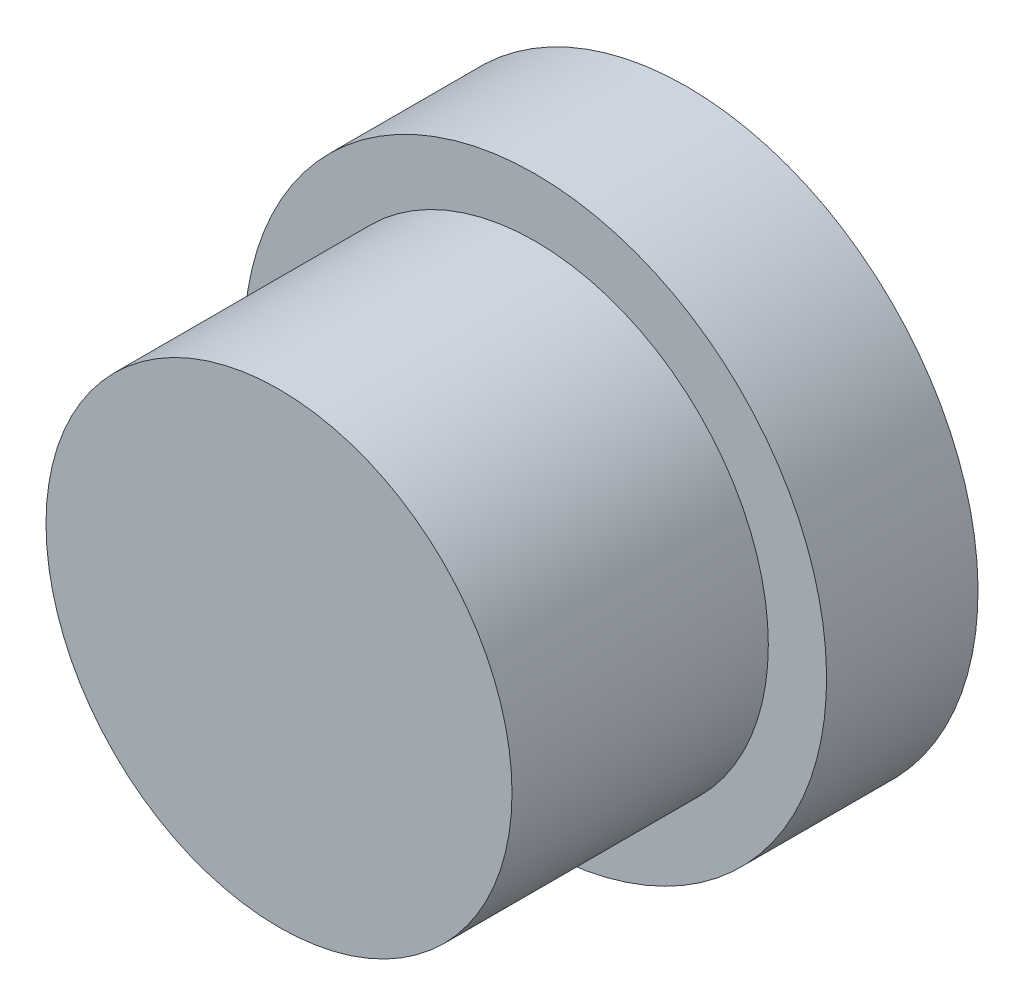
ISO-10303-21;
HEADER;
FILE_DESCRIPTION(('STEP AP214'),'2;1');
FILE_NAME('part.step','',(''),(''),'','','');
FILE_SCHEMA(('AUTOMOTIVE_DESIGN { 1 0 10303 214 1 1 1 1 }'));
ENDSEC;
DATA;
#1=APPLICATION_CONTEXT('core data for automotive mechanical design processes');
#2=APPLICATION_PROTOCOL_DEFINITION('international standard','automotive_design',2000,#1);
#3=PRODUCT_CONTEXT('',#1,'mechanical');
#4=PRODUCT('Part','Part','',(#3));
#5=PRODUCT_RELATED_PRODUCT_CATEGORY('part','',(#4));
#6=PRODUCT_DEFINITION_FORMATION('','',#4);
#7=PRODUCT_DEFINITION_CONTEXT('part definition',#1,'design');
#8=PRODUCT_DEFINITION('design','',#6,#7);
#9=PRODUCT_DEFINITION_SHAPE('','',#8);
#10=(LENGTH_UNIT() NAMED_UNIT(*) SI_UNIT(.MILLI.,.METRE.));
#11=(NAMED_UNIT(*) PLANE_ANGLE_UNIT() SI_UNIT($,.RADIAN.));
#12=(NAMED_UNIT(*) SI_UNIT($,.STERADIAN.) SOLID_ANGLE_UNIT());
#13=UNCERTAINTY_MEASURE_WITH_UNIT(LENGTH_MEASURE(1.E-05),#10,'distance_accuracy_value','');
#14=(GEOMETRIC_REPRESENTATION_CONTEXT(3) GLOBAL_UNCERTAINTY_ASSIGNED_CONTEXT((#13)) GLOBAL_UNIT_ASSIGNED_CONTEXT((#10,
#11,#12)) REPRESENTATION_CONTEXT('',''));
#15=CARTESIAN_POINT('',(0.,0.,0.));
#16=DIRECTION('',(0.,0.,1.));
#17=DIRECTION('',(1.,0.,0.));
#18=AXIS2_PLACEMENT_3D('',#15,#16,#17);
#19=CARTESIAN_POINT('',(0.686373767410355,96.6001412667392,352.724757540733));
#20=DIRECTION('',(0.,0.,1.));
#21=DIRECTION('',(1.,0.,0.));
#22=AXIS2_PLACEMENT_3D('',#19,#20,#21);
#23=PLANE('',#22);
#24=CARTESIAN_POINT('',(0.686373767410355,96.6001412667392,352.724757540733));
#25=DIRECTION('',(0.,0.,1.));
#26=DIRECTION('',(0.,-1.,0.));
#27=AXIS2_PLACEMENT_3D('',#24,#25,#26);
#28=CIRCLE('',#27,2.);
#29=CARTESIAN_POINT('',(0.686373767410355,94.6001412667392,352.724757540733));
#30=VERTEX_POINT('',#29);
#31=EDGE_CURVE('E11',#30,#30,#28,.T.);
#32=ORIENTED_EDGE('',*,*,#31,.T.);
#33=EDGE_LOOP('',(#32));
#34=FACE_BOUND('',#33,.T.);
#35=ADVANCED_FACE('F42',(#34),#23,.T.);
#36=CARTESIAN_POINT('',(0.686373767410355,96.6001412667392,352.724757540733));
#37=DIRECTION('',(0.,0.,-1.));
#38=DIRECTION('',(0.866025403784439,-0.5,0.));
#39=AXIS2_PLACEMENT_3D('',#36,#37,#38);
#40=CYLINDRICAL_SURFACE('',#39,2.);
#41=CARTESIAN_POINT('',(0.686373767410355,96.6001412667392,350.524757540734));
#42=DIRECTION('',(0.,0.,-1.));
#43=DIRECTION('',(0.,1.,0.));
#44=AXIS2_PLACEMENT_3D('',#41,#42,#43);
#45=CIRCLE('',#44,2.);
#46=CARTESIAN_POINT('',(0.686373767410355,98.6001412667392,350.524757540734));
#47=VERTEX_POINT('',#46);
#48=EDGE_CURVE('E46',#47,#47,#45,.T.);
#49=ORIENTED_EDGE('',*,*,#48,.F.);
#50=EDGE_LOOP('',(#49));
#51=FACE_BOUND('',#50,.T.);
#52=ORIENTED_EDGE('',*,*,#31,.F.);
#53=EDGE_LOOP('',(#52));
#54=FACE_BOUND('',#53,.T.);
#55=ADVANCED_FACE('F44',(#51,#54),#40,.T.);
#56=CARTESIAN_POINT('',(0.686373767410355,96.6001412667392,350.524757540734));
#57=DIRECTION('',(0.,0.,-1.));
#58=DIRECTION('',(0.,-1.,0.));
#59=AXIS2_PLACEMENT_3D('',#56,#57,#58);
#60=PLANE('',#59);
#61=CARTESIAN_POINT('',(0.686373767410355,96.6001412667392,350.524757540734));
#62=DIRECTION('',(0.,0.,1.));
#63=DIRECTION('',(0.,1.,0.));
#64=AXIS2_PLACEMENT_3D('',#61,#62,#63);
#65=CIRCLE('',#64,2.5);
#66=CARTESIAN_POINT('',(0.686373767410355,99.1001412667392,350.524757540734));
#67=VERTEX_POINT('',#66);
#68=EDGE_CURVE('E72',#67,#67,#65,.T.);
#69=ORIENTED_EDGE('',*,*,#68,.T.);
#70=EDGE_LOOP('',(#69));
#71=FACE_BOUND('',#70,.T.);
#72=ORIENTED_EDGE('',*,*,#48,.T.);
#73=EDGE_LOOP('',(#72));
#74=FACE_BOUND('',#73,.T.);
#75=ADVANCED_FACE('F73',(#71,#74),#60,.F.);
#76=CARTESIAN_POINT('',(0.686373767410355,96.6001412667392,352.724757540733));
#77=DIRECTION('',(0.,0.,-1.));
#78=DIRECTION('',(0.866025403784439,-0.5,0.));
#79=AXIS2_PLACEMENT_3D('',#76,#77,#78);
#80=CYLINDRICAL_SURFACE('',#79,2.5);
#81=CARTESIAN_POINT('',(0.686373767410355,96.6001412667392,349.224757540733));
#82=DIRECTION('',(0.,0.,1.));
#83=DIRECTION('',(-0.866025403784439,0.5,0.));
#84=AXIS2_PLACEMENT_3D('',#81,#82,#83);
#85=CIRCLE('',#84,2.5);
#86=CARTESIAN_POINT('',(-1.47868974205074,97.8501412667392,349.224757540733));
#87=VERTEX_POINT('',#86);
#88=EDGE_CURVE('E77',#87,#87,#85,.T.);
#89=ORIENTED_EDGE('',*,*,#88,.T.);
#90=EDGE_LOOP('',(#89));
#91=FACE_BOUND('',#90,.T.);
#92=ORIENTED_EDGE('',*,*,#68,.F.);
#93=EDGE_LOOP('',(#92));
#94=FACE_BOUND('',#93,.T.);
#95=ADVANCED_FACE('F85',(#91,#94),#80,.T.);
#96=CARTESIAN_POINT('',(0.686373767410355,96.6001412667392,349.224757540733));
#97=DIRECTION('',(0.,0.,1.));
#98=DIRECTION('',(1.,0.,0.));
#99=AXIS2_PLACEMENT_3D('',#96,#97,#98);
#100=PLANE('',#99);
#101=ORIENTED_EDGE('',*,*,#88,.F.);
#102=EDGE_LOOP('',(#101));
#103=FACE_BOUND('',#102,.T.);
#104=ADVANCED_FACE('F87',(#103),#100,.F.);
#105=CLOSED_SHELL('',(#35,#55,#75,#95,#104));
#106=MANIFOLD_SOLID_BREP('B2',#105);
#107=ADVANCED_BREP_SHAPE_REPRESENTATION('',(#18,#106),#14);
#108=SHAPE_DEFINITION_REPRESENTATION(#9,#107);
ENDSEC;
END-ISO-10303-21;
